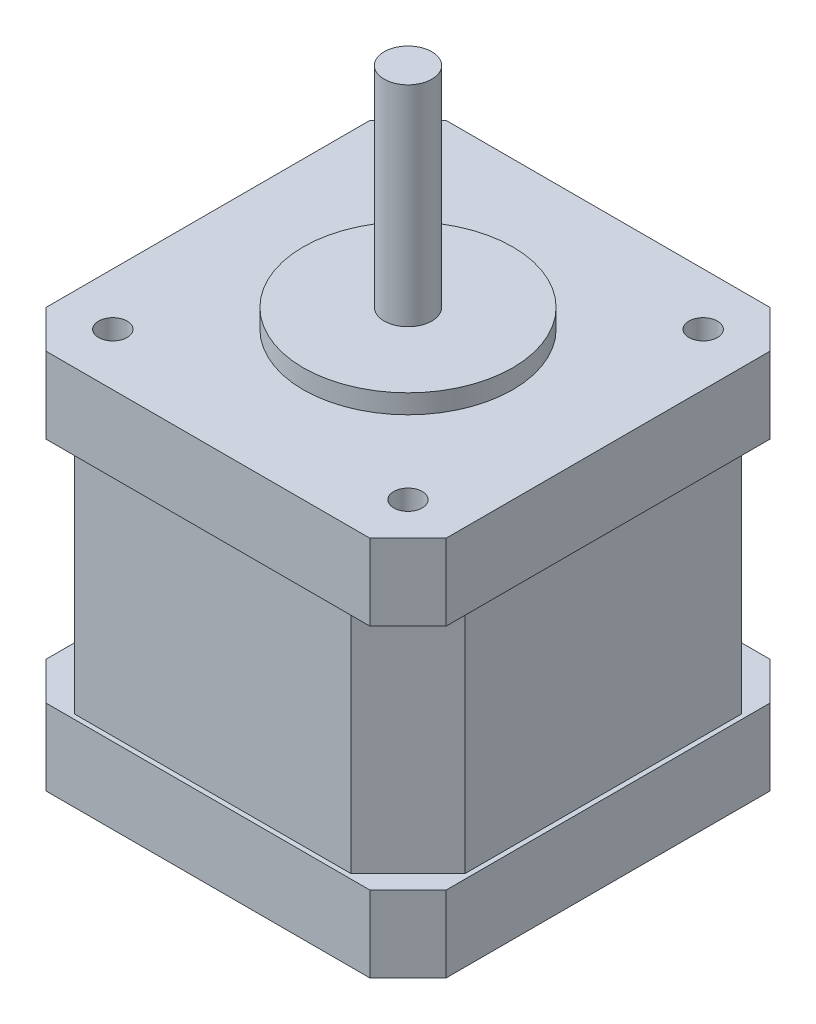
ISO-10303-21;
HEADER;
FILE_DESCRIPTION(('STEP AP214'),'2;1');
FILE_NAME('part.step','',(''),(''),'','','');
FILE_SCHEMA(('AUTOMOTIVE_DESIGN { 1 0 10303 214 1 1 1 1 }'));
ENDSEC;
DATA;
#1=APPLICATION_CONTEXT('core data for automotive mechanical design processes');
#2=APPLICATION_PROTOCOL_DEFINITION('international standard','automotive_design',2000,#1);
#3=PRODUCT_CONTEXT('',#1,'mechanical');
#4=PRODUCT('Part','Part','',(#3));
#5=PRODUCT_RELATED_PRODUCT_CATEGORY('part','',(#4));
#6=PRODUCT_DEFINITION_FORMATION('','',#4);
#7=PRODUCT_DEFINITION_CONTEXT('part definition',#1,'design');
#8=PRODUCT_DEFINITION('design','',#6,#7);
#9=PRODUCT_DEFINITION_SHAPE('','',#8);
#10=(LENGTH_UNIT() NAMED_UNIT(*) SI_UNIT(.MILLI.,.METRE.));
#11=(NAMED_UNIT(*) PLANE_ANGLE_UNIT() SI_UNIT($,.RADIAN.));
#12=(NAMED_UNIT(*) SI_UNIT($,.STERADIAN.) SOLID_ANGLE_UNIT());
#13=UNCERTAINTY_MEASURE_WITH_UNIT(LENGTH_MEASURE(1.E-05),#10,'distance_accuracy_value','');
#14=(GEOMETRIC_REPRESENTATION_CONTEXT(3) GLOBAL_UNCERTAINTY_ASSIGNED_CONTEXT((#13)) GLOBAL_UNIT_ASSIGNED_CONTEXT((#10,
#11,#12)) REPRESENTATION_CONTEXT('',''));
#15=CARTESIAN_POINT('',(0.,0.,0.));
#16=DIRECTION('',(0.,0.,1.));
#17=DIRECTION('',(1.,0.,0.));
#18=AXIS2_PLACEMENT_3D('',#15,#16,#17);
#19=CARTESIAN_POINT('',(0.,10.,0.));
#20=DIRECTION('',(0.,1.,0.));
#21=DIRECTION('',(0.,0.,1.));
#22=AXIS2_PLACEMENT_3D('',#19,#20,#21);
#23=PLANE('',#22);
#24=CARTESIAN_POINT('',(0.,10.,0.));
#25=DIRECTION('',(0.,1.,0.));
#26=DIRECTION('',(0.,0.,1.));
#27=AXIS2_PLACEMENT_3D('',#24,#25,#26);
#28=CIRCLE('',#27,11.);
#29=CARTESIAN_POINT('',(0.,10.,11.));
#30=VERTEX_POINT('',#29);
#31=EDGE_CURVE('E484',#30,#30,#28,.T.);
#32=ORIENTED_EDGE('',*,*,#31,.T.);
#33=EDGE_LOOP('',(#32));
#34=FACE_BOUND('',#33,.T.);
#35=CARTESIAN_POINT('',(0.,10.,0.));
#36=DIRECTION('',(0.,1.,0.));
#37=DIRECTION('',(0.,0.,1.));
#38=AXIS2_PLACEMENT_3D('',#35,#36,#37);
#39=CIRCLE('',#38,2.5);
#40=CARTESIAN_POINT('',(0.,10.,2.5));
#41=VERTEX_POINT('',#40);
#42=EDGE_CURVE('E500',#41,#41,#39,.T.);
#43=ORIENTED_EDGE('',*,*,#42,.F.);
#44=EDGE_LOOP('',(#43));
#45=FACE_BOUND('',#44,.T.);
#46=ADVANCED_FACE('F37',(#34,#45),#23,.T.);
#47=CARTESIAN_POINT('',(0.,8.,0.));
#48=DIRECTION('',(0.,1.,0.));
#49=DIRECTION('',(0.,0.,1.));
#50=AXIS2_PLACEMENT_3D('',#47,#48,#49);
#51=PLANE('',#50);
#52=CARTESIAN_POINT('',(-15.5,8.,15.5));
#53=DIRECTION('',(0.,1.,0.));
#54=DIRECTION('',(0.,0.,1.));
#55=AXIS2_PLACEMENT_3D('',#52,#53,#54);
#56=CIRCLE('',#55,1.5);
#57=CARTESIAN_POINT('',(-15.5,8.,17.));
#58=VERTEX_POINT('',#57);
#59=EDGE_CURVE('E524',#58,#58,#56,.T.);
#60=ORIENTED_EDGE('',*,*,#59,.F.);
#61=EDGE_LOOP('',(#60));
#62=FACE_BOUND('',#61,.T.);
#63=CARTESIAN_POINT('',(15.5,8.,15.5));
#64=DIRECTION('',(0.,1.,0.));
#65=DIRECTION('',(0.,0.,1.));
#66=AXIS2_PLACEMENT_3D('',#63,#64,#65);
#67=CIRCLE('',#66,1.5);
#68=CARTESIAN_POINT('',(15.5,8.,17.));
#69=VERTEX_POINT('',#68);
#70=EDGE_CURVE('E518',#69,#69,#67,.T.);
#71=ORIENTED_EDGE('',*,*,#70,.F.);
#72=EDGE_LOOP('',(#71));
#73=FACE_BOUND('',#72,.T.);
#74=CARTESIAN_POINT('',(15.5,8.,-15.5));
#75=DIRECTION('',(0.,1.,0.));
#76=DIRECTION('',(0.,0.,1.));
#77=AXIS2_PLACEMENT_3D('',#74,#75,#76);
#78=CIRCLE('',#77,1.5);
#79=CARTESIAN_POINT('',(15.5,8.,-14.));
#80=VERTEX_POINT('',#79);
#81=EDGE_CURVE('E512',#80,#80,#78,.T.);
#82=ORIENTED_EDGE('',*,*,#81,.F.);
#83=EDGE_LOOP('',(#82));
#84=FACE_BOUND('',#83,.T.);
#85=CARTESIAN_POINT('',(-15.5,8.,-15.5));
#86=DIRECTION('',(0.,1.,0.));
#87=DIRECTION('',(0.,0.,1.));
#88=AXIS2_PLACEMENT_3D('',#85,#86,#87);
#89=CIRCLE('',#88,1.5);
#90=CARTESIAN_POINT('',(-15.5,8.,-14.));
#91=VERTEX_POINT('',#90);
#92=EDGE_CURVE('E506',#91,#91,#89,.T.);
#93=ORIENTED_EDGE('',*,*,#92,.F.);
#94=EDGE_LOOP('',(#93));
#95=FACE_BOUND('',#94,.T.);
#96=DIRECTION('',(-1.,0.,0.));
#97=VECTOR('',#96,1.);
#98=CARTESIAN_POINT('',(-21.,8.,-21.));
#99=LINE('',#98,#97);
#100=CARTESIAN_POINT('',(17.,8.,-21.));
#101=VERTEX_POINT('',#100);
#102=CARTESIAN_POINT('',(-17.,8.,-21.));
#103=VERTEX_POINT('',#102);
#104=EDGE_CURVE('E210',#101,#103,#99,.T.);
#105=ORIENTED_EDGE('',*,*,#104,.T.);
#106=DIRECTION('',(0.707106781186549,0.,-0.707106781186546));
#107=VECTOR('',#106,1.);
#108=CARTESIAN_POINT('',(-19.,8.,-19.));
#109=LINE('',#108,#107);
#110=CARTESIAN_POINT('',(-21.,8.,-17.));
#111=VERTEX_POINT('',#110);
#112=EDGE_CURVE('E298',#103,#111,#109,.F.);
#113=ORIENTED_EDGE('',*,*,#112,.T.);
#114=DIRECTION('',(0.,0.,1.));
#115=VECTOR('',#114,1.);
#116=CARTESIAN_POINT('',(-21.,8.,-21.));
#117=LINE('',#116,#115);
#118=CARTESIAN_POINT('',(-21.,8.,17.));
#119=VERTEX_POINT('',#118);
#120=EDGE_CURVE('E322',#111,#119,#117,.T.);
#121=ORIENTED_EDGE('',*,*,#120,.T.);
#122=DIRECTION('',(-0.707106781186546,0.,-0.707106781186549));
#123=VECTOR('',#122,1.);
#124=CARTESIAN_POINT('',(-19.,8.,19.));
#125=LINE('',#124,#123);
#126=CARTESIAN_POINT('',(-17.,8.,21.));
#127=VERTEX_POINT('',#126);
#128=EDGE_CURVE('E296',#119,#127,#125,.F.);
#129=ORIENTED_EDGE('',*,*,#128,.T.);
#130=DIRECTION('',(1.,0.,0.));
#131=VECTOR('',#130,1.);
#132=CARTESIAN_POINT('',(-21.,8.,21.));
#133=LINE('',#132,#131);
#134=CARTESIAN_POINT('',(17.,8.,21.));
#135=VERTEX_POINT('',#134);
#136=EDGE_CURVE('E440',#127,#135,#133,.T.);
#137=ORIENTED_EDGE('',*,*,#136,.T.);
#138=DIRECTION('',(-0.707106781186548,0.,0.707106781186547));
#139=VECTOR('',#138,1.);
#140=CARTESIAN_POINT('',(19.,8.,19.));
#141=LINE('',#140,#139);
#142=CARTESIAN_POINT('',(21.,8.,17.));
#143=VERTEX_POINT('',#142);
#144=EDGE_CURVE('E57',#135,#143,#141,.F.);
#145=ORIENTED_EDGE('',*,*,#144,.T.);
#146=DIRECTION('',(0.,0.,-1.));
#147=VECTOR('',#146,1.);
#148=CARTESIAN_POINT('',(21.,8.,-21.));
#149=LINE('',#148,#147);
#150=CARTESIAN_POINT('',(21.,8.,-17.));
#151=VERTEX_POINT('',#150);
#152=EDGE_CURVE('E309',#143,#151,#149,.T.);
#153=ORIENTED_EDGE('',*,*,#152,.T.);
#154=DIRECTION('',(0.707106781186546,0.,0.707106781186549));
#155=VECTOR('',#154,1.);
#156=CARTESIAN_POINT('',(19.,8.,-19.));
#157=LINE('',#156,#155);
#158=EDGE_CURVE('E294',#151,#101,#157,.F.);
#159=ORIENTED_EDGE('',*,*,#158,.T.);
#160=EDGE_LOOP('',(#105,#113,#121,#129,#137,#145,#153,#159));
#161=FACE_BOUND('',#160,.T.);
#162=CARTESIAN_POINT('',(0.,8.,0.));
#163=DIRECTION('',(0.,1.,0.));
#164=DIRECTION('',(0.,0.,1.));
#165=AXIS2_PLACEMENT_3D('',#162,#163,#164);
#166=CIRCLE('',#165,11.);
#167=CARTESIAN_POINT('',(0.,8.,11.));
#168=VERTEX_POINT('',#167);
#169=EDGE_CURVE('E495',#168,#168,#166,.T.);
#170=ORIENTED_EDGE('',*,*,#169,.F.);
#171=EDGE_LOOP('',(#170));
#172=FACE_BOUND('',#171,.T.);
#173=ADVANCED_FACE('F370',(#62,#73,#84,#95,#161,#172),#51,.T.);
#174=CARTESIAN_POINT('',(0.,0.,0.));
#175=DIRECTION('',(0.,1.,0.));
#176=DIRECTION('',(0.,0.,1.));
#177=AXIS2_PLACEMENT_3D('',#174,#175,#176);
#178=PLANE('',#177);
#179=DIRECTION('',(0.,0.,1.));
#180=VECTOR('',#179,1.);
#181=CARTESIAN_POINT('',(-21.,0.,-21.));
#182=LINE('',#181,#180);
#183=CARTESIAN_POINT('',(-21.,0.,-17.));
#184=VERTEX_POINT('',#183);
#185=CARTESIAN_POINT('',(-21.,0.,17.));
#186=VERTEX_POINT('',#185);
#187=EDGE_CURVE('E324',#184,#186,#182,.T.);
#188=ORIENTED_EDGE('',*,*,#187,.F.);
#189=DIRECTION('',(-0.707106781186549,0.,0.707106781186546));
#190=VECTOR('',#189,1.);
#191=CARTESIAN_POINT('',(-21.,0.,-17.));
#192=LINE('',#191,#190);
#193=CARTESIAN_POINT('',(-17.,0.,-21.));
#194=VERTEX_POINT('',#193);
#195=EDGE_CURVE('E286',#184,#194,#192,.F.);
#196=ORIENTED_EDGE('',*,*,#195,.T.);
#197=DIRECTION('',(-1.,0.,0.));
#198=VECTOR('',#197,1.);
#199=CARTESIAN_POINT('',(-21.,0.,-21.));
#200=LINE('',#199,#198);
#201=CARTESIAN_POINT('',(17.,0.,-21.));
#202=VERTEX_POINT('',#201);
#203=EDGE_CURVE('E318',#202,#194,#200,.T.);
#204=ORIENTED_EDGE('',*,*,#203,.F.);
#205=DIRECTION('',(-0.707106781186546,0.,-0.707106781186549));
#206=VECTOR('',#205,1.);
#207=CARTESIAN_POINT('',(17.,0.,-21.));
#208=LINE('',#207,#206);
#209=CARTESIAN_POINT('',(21.,0.,-17.));
#210=VERTEX_POINT('',#209);
#211=EDGE_CURVE('E282',#202,#210,#208,.F.);
#212=ORIENTED_EDGE('',*,*,#211,.T.);
#213=DIRECTION('',(0.,0.,-1.));
#214=VECTOR('',#213,1.);
#215=CARTESIAN_POINT('',(21.,0.,-21.));
#216=LINE('',#215,#214);
#217=CARTESIAN_POINT('',(21.,0.,17.));
#218=VERTEX_POINT('',#217);
#219=EDGE_CURVE('E308',#218,#210,#216,.T.);
#220=ORIENTED_EDGE('',*,*,#219,.F.);
#221=DIRECTION('',(0.707106781186548,0.,-0.707106781186547));
#222=VECTOR('',#221,1.);
#223=CARTESIAN_POINT('',(21.,0.,17.));
#224=LINE('',#223,#222);
#225=CARTESIAN_POINT('',(17.,0.,21.));
#226=VERTEX_POINT('',#225);
#227=EDGE_CURVE('E280',#218,#226,#224,.F.);
#228=ORIENTED_EDGE('',*,*,#227,.T.);
#229=DIRECTION('',(1.,0.,0.));
#230=VECTOR('',#229,1.);
#231=CARTESIAN_POINT('',(-21.,0.,21.));
#232=LINE('',#231,#230);
#233=CARTESIAN_POINT('',(-17.,0.,21.));
#234=VERTEX_POINT('',#233);
#235=EDGE_CURVE('E319',#234,#226,#232,.T.);
#236=ORIENTED_EDGE('',*,*,#235,.F.);
#237=DIRECTION('',(0.707106781186546,0.,0.707106781186549));
#238=VECTOR('',#237,1.);
#239=CARTESIAN_POINT('',(-17.,0.,21.));
#240=LINE('',#239,#238);
#241=EDGE_CURVE('E284',#234,#186,#240,.F.);
#242=ORIENTED_EDGE('',*,*,#241,.T.);
#243=EDGE_LOOP('',(#188,#196,#204,#212,#220,#228,#236,#242));
#244=FACE_BOUND('',#243,.T.);
#245=DIRECTION('',(-1.,0.,0.));
#246=VECTOR('',#245,1.);
#247=CARTESIAN_POINT('',(20.5,0.,20.5));
#248=LINE('',#247,#246);
#249=CARTESIAN_POINT('',(14.5,0.,20.5));
#250=VERTEX_POINT('',#249);
#251=CARTESIAN_POINT('',(-14.5,0.,20.5));
#252=VERTEX_POINT('',#251);
#253=EDGE_CURVE('E456',#250,#252,#248,.T.);
#254=ORIENTED_EDGE('',*,*,#253,.F.);
#255=DIRECTION('',(-0.707106781186546,0.,0.707106781186549));
#256=VECTOR('',#255,1.);
#257=CARTESIAN_POINT('',(17.5,0.,17.5));
#258=LINE('',#257,#256);
#259=CARTESIAN_POINT('',(20.5,0.,14.5));
#260=VERTEX_POINT('',#259);
#261=EDGE_CURVE('E227',#250,#260,#258,.F.);
#262=ORIENTED_EDGE('',*,*,#261,.T.);
#263=DIRECTION('',(0.,0.,1.));
#264=VECTOR('',#263,1.);
#265=CARTESIAN_POINT('',(20.5,0.,-20.5));
#266=LINE('',#265,#264);
#267=CARTESIAN_POINT('',(20.5,0.,-14.5));
#268=VERTEX_POINT('',#267);
#269=EDGE_CURVE('E206',#268,#260,#266,.T.);
#270=ORIENTED_EDGE('',*,*,#269,.F.);
#271=DIRECTION('',(0.707106781186549,0.,0.707106781186546));
#272=VECTOR('',#271,1.);
#273=CARTESIAN_POINT('',(17.4999999999999,0.,-17.5));
#274=LINE('',#273,#272);
#275=CARTESIAN_POINT('',(14.5,0.,-20.5));
#276=VERTEX_POINT('',#275);
#277=EDGE_CURVE('E342',#268,#276,#274,.F.);
#278=ORIENTED_EDGE('',*,*,#277,.T.);
#279=DIRECTION('',(1.,0.,0.));
#280=VECTOR('',#279,1.);
#281=CARTESIAN_POINT('',(-20.5,0.,-20.5));
#282=LINE('',#281,#280);
#283=CARTESIAN_POINT('',(-14.5,0.,-20.5));
#284=VERTEX_POINT('',#283);
#285=EDGE_CURVE('E346',#284,#276,#282,.T.);
#286=ORIENTED_EDGE('',*,*,#285,.F.);
#287=DIRECTION('',(0.707106781186546,0.,-0.707106781186549));
#288=VECTOR('',#287,1.);
#289=CARTESIAN_POINT('',(-17.5,0.,-17.5));
#290=LINE('',#289,#288);
#291=CARTESIAN_POINT('',(-20.5,0.,-14.5));
#292=VERTEX_POINT('',#291);
#293=EDGE_CURVE('E235',#284,#292,#290,.F.);
#294=ORIENTED_EDGE('',*,*,#293,.T.);
#295=DIRECTION('',(0.,0.,-1.));
#296=VECTOR('',#295,1.);
#297=CARTESIAN_POINT('',(-20.5,0.,20.5));
#298=LINE('',#297,#296);
#299=CARTESIAN_POINT('',(-20.5,0.,14.5));
#300=VERTEX_POINT('',#299);
#301=EDGE_CURVE('E353',#300,#292,#298,.T.);
#302=ORIENTED_EDGE('',*,*,#301,.F.);
#303=DIRECTION('',(-0.707106781186549,0.,-0.707106781186546));
#304=VECTOR('',#303,1.);
#305=CARTESIAN_POINT('',(-17.4999999999999,0.,17.5));
#306=LINE('',#305,#304);
#307=EDGE_CURVE('E226',#300,#252,#306,.F.);
#308=ORIENTED_EDGE('',*,*,#307,.T.);
#309=EDGE_LOOP('',(#254,#262,#270,#278,#286,#294,#302,#308));
#310=FACE_BOUND('',#309,.T.);
#311=ADVANCED_FACE('F313',(#244,#310),#178,.F.);
#312=CARTESIAN_POINT('',(-21.,8.,-21.));
#313=DIRECTION('',(1.,0.,0.));
#314=DIRECTION('',(0.,0.,-1.));
#315=AXIS2_PLACEMENT_3D('',#312,#313,#314);
#316=PLANE('',#315);
#317=ORIENTED_EDGE('',*,*,#120,.F.);
#318=DIRECTION('',(0.,-1.,0.));
#319=VECTOR('',#318,1.);
#320=CARTESIAN_POINT('',(-21.,8.,-17.));
#321=LINE('',#320,#319);
#322=EDGE_CURVE('E277',#111,#184,#321,.T.);
#323=ORIENTED_EDGE('',*,*,#322,.T.);
#324=ORIENTED_EDGE('',*,*,#187,.T.);
#325=DIRECTION('',(0.,1.,0.));
#326=VECTOR('',#325,1.);
#327=CARTESIAN_POINT('',(-21.,8.,17.));
#328=LINE('',#327,#326);
#329=EDGE_CURVE('E275',#186,#119,#328,.T.);
#330=ORIENTED_EDGE('',*,*,#329,.T.);
#331=EDGE_LOOP('',(#317,#323,#324,#330));
#332=FACE_BOUND('',#331,.T.);
#333=ADVANCED_FACE('F421',(#332),#316,.F.);
#334=CARTESIAN_POINT('',(-21.,8.,21.));
#335=DIRECTION('',(0.,0.,-1.));
#336=DIRECTION('',(-1.,0.,0.));
#337=AXIS2_PLACEMENT_3D('',#334,#335,#336);
#338=PLANE('',#337);
#339=ORIENTED_EDGE('',*,*,#136,.F.);
#340=DIRECTION('',(0.,-1.,0.));
#341=VECTOR('',#340,1.);
#342=CARTESIAN_POINT('',(-17.,8.,21.));
#343=LINE('',#342,#341);
#344=EDGE_CURVE('E302',#127,#234,#343,.T.);
#345=ORIENTED_EDGE('',*,*,#344,.T.);
#346=ORIENTED_EDGE('',*,*,#235,.T.);
#347=DIRECTION('',(0.,1.,0.));
#348=VECTOR('',#347,1.);
#349=CARTESIAN_POINT('',(17.,8.,21.));
#350=LINE('',#349,#348);
#351=EDGE_CURVE('E300',#226,#135,#350,.T.);
#352=ORIENTED_EDGE('',*,*,#351,.T.);
#353=EDGE_LOOP('',(#339,#345,#346,#352));
#354=FACE_BOUND('',#353,.T.);
#355=ADVANCED_FACE('F427',(#354),#338,.F.);
#356=CARTESIAN_POINT('',(21.,8.,-21.));
#357=DIRECTION('',(-1.,0.,0.));
#358=DIRECTION('',(0.,0.,1.));
#359=AXIS2_PLACEMENT_3D('',#356,#357,#358);
#360=PLANE('',#359);
#361=ORIENTED_EDGE('',*,*,#219,.T.);
#362=DIRECTION('',(0.,1.,0.));
#363=VECTOR('',#362,1.);
#364=CARTESIAN_POINT('',(21.,8.,-17.));
#365=LINE('',#364,#363);
#366=EDGE_CURVE('E11',#210,#151,#365,.T.);
#367=ORIENTED_EDGE('',*,*,#366,.T.);
#368=ORIENTED_EDGE('',*,*,#152,.F.);
#369=DIRECTION('',(0.,-1.,0.));
#370=VECTOR('',#369,1.);
#371=CARTESIAN_POINT('',(21.,8.,17.));
#372=LINE('',#371,#370);
#373=EDGE_CURVE('E45',#143,#218,#372,.T.);
#374=ORIENTED_EDGE('',*,*,#373,.T.);
#375=EDGE_LOOP('',(#361,#367,#368,#374));
#376=FACE_BOUND('',#375,.T.);
#377=ADVANCED_FACE('F307',(#376),#360,.F.);
#378=CARTESIAN_POINT('',(-21.,8.,-21.));
#379=DIRECTION('',(0.,0.,1.));
#380=DIRECTION('',(1.,0.,0.));
#381=AXIS2_PLACEMENT_3D('',#378,#379,#380);
#382=PLANE('',#381);
#383=ORIENTED_EDGE('',*,*,#203,.T.);
#384=DIRECTION('',(0.,1.,0.));
#385=VECTOR('',#384,1.);
#386=CARTESIAN_POINT('',(-17.,8.,-21.));
#387=LINE('',#386,#385);
#388=EDGE_CURVE('E291',#194,#103,#387,.T.);
#389=ORIENTED_EDGE('',*,*,#388,.T.);
#390=ORIENTED_EDGE('',*,*,#104,.F.);
#391=DIRECTION('',(0.,-1.,0.));
#392=VECTOR('',#391,1.);
#393=CARTESIAN_POINT('',(17.,8.,-21.));
#394=LINE('',#393,#392);
#395=EDGE_CURVE('E288',#101,#202,#394,.T.);
#396=ORIENTED_EDGE('',*,*,#395,.T.);
#397=EDGE_LOOP('',(#383,#389,#390,#396));
#398=FACE_BOUND('',#397,.T.);
#399=ADVANCED_FACE('F415',(#398),#382,.F.);
#400=CARTESIAN_POINT('',(20.5,-500000.,20.5));
#401=DIRECTION('',(0.,0.,-1.));
#402=DIRECTION('',(-1.,0.,0.));
#403=AXIS2_PLACEMENT_3D('',#400,#401,#402);
#404=PLANE('',#403);
#405=DIRECTION('',(1.,0.,0.));
#406=VECTOR('',#405,1.);
#407=CARTESIAN_POINT('',(20.5,-24.0000000000009,20.5));
#408=LINE('',#407,#406);
#409=CARTESIAN_POINT('',(-14.5,-24.0000000000009,20.5));
#410=VERTEX_POINT('',#409);
#411=CARTESIAN_POINT('',(14.5,-24.0000000000009,20.5));
#412=VERTEX_POINT('',#411);
#413=EDGE_CURVE('E468',#410,#412,#408,.T.);
#414=ORIENTED_EDGE('',*,*,#413,.T.);
#415=DIRECTION('',(0.,1.,0.));
#416=VECTOR('',#415,1.);
#417=CARTESIAN_POINT('',(14.5,-500000.,20.5));
#418=LINE('',#417,#416);
#419=EDGE_CURVE('E225',#412,#250,#418,.T.);
#420=ORIENTED_EDGE('',*,*,#419,.T.);
#421=ORIENTED_EDGE('',*,*,#253,.T.);
#422=DIRECTION('',(0.,-1.,0.));
#423=VECTOR('',#422,1.);
#424=CARTESIAN_POINT('',(-14.5,-500000.,20.5));
#425=LINE('',#424,#423);
#426=EDGE_CURVE('E334',#252,#410,#425,.T.);
#427=ORIENTED_EDGE('',*,*,#426,.T.);
#428=EDGE_LOOP('',(#414,#420,#421,#427));
#429=FACE_BOUND('',#428,.T.);
#430=ADVANCED_FACE('F391',(#429),#404,.F.);
#431=CARTESIAN_POINT('',(-20.5,-500000.,20.5));
#432=DIRECTION('',(1.,0.,0.));
#433=DIRECTION('',(0.,0.,-1.));
#434=AXIS2_PLACEMENT_3D('',#431,#432,#433);
#435=PLANE('',#434);
#436=DIRECTION('',(0.,0.,1.));
#437=VECTOR('',#436,1.);
#438=CARTESIAN_POINT('',(-20.5,-24.0000000000009,20.5));
#439=LINE('',#438,#437);
#440=CARTESIAN_POINT('',(-20.5,-24.0000000000009,-14.5));
#441=VERTEX_POINT('',#440);
#442=CARTESIAN_POINT('',(-20.5,-24.0000000000009,14.5));
#443=VERTEX_POINT('',#442);
#444=EDGE_CURVE('E465',#441,#443,#439,.T.);
#445=ORIENTED_EDGE('',*,*,#444,.T.);
#446=DIRECTION('',(0.,1.,0.));
#447=VECTOR('',#446,1.);
#448=CARTESIAN_POINT('',(-20.5,-500000.,14.5));
#449=LINE('',#448,#447);
#450=EDGE_CURVE('E339',#443,#300,#449,.T.);
#451=ORIENTED_EDGE('',*,*,#450,.T.);
#452=ORIENTED_EDGE('',*,*,#301,.T.);
#453=DIRECTION('',(0.,-1.,0.));
#454=VECTOR('',#453,1.);
#455=CARTESIAN_POINT('',(-20.5,-500000.,-14.5));
#456=LINE('',#455,#454);
#457=EDGE_CURVE('E337',#292,#441,#456,.T.);
#458=ORIENTED_EDGE('',*,*,#457,.T.);
#459=EDGE_LOOP('',(#445,#451,#452,#458));
#460=FACE_BOUND('',#459,.T.);
#461=ADVANCED_FACE('F407',(#460),#435,.F.);
#462=CARTESIAN_POINT('',(-20.5,-500000.,-20.5));
#463=DIRECTION('',(0.,0.,1.));
#464=DIRECTION('',(1.,0.,0.));
#465=AXIS2_PLACEMENT_3D('',#462,#463,#464);
#466=PLANE('',#465);
#467=ORIENTED_EDGE('',*,*,#285,.T.);
#468=DIRECTION('',(0.,-1.,0.));
#469=VECTOR('',#468,1.);
#470=CARTESIAN_POINT('',(14.5,-500000.,-20.5));
#471=LINE('',#470,#469);
#472=CARTESIAN_POINT('',(14.5,-24.0000000000009,-20.5));
#473=VERTEX_POINT('',#472);
#474=EDGE_CURVE('E332',#276,#473,#471,.T.);
#475=ORIENTED_EDGE('',*,*,#474,.T.);
#476=DIRECTION('',(-1.,0.,0.));
#477=VECTOR('',#476,1.);
#478=CARTESIAN_POINT('',(-20.5,-24.0000000000009,-20.5));
#479=LINE('',#478,#477);
#480=CARTESIAN_POINT('',(-14.5,-24.0000000000009,-20.5));
#481=VERTEX_POINT('',#480);
#482=EDGE_CURVE('E220',#473,#481,#479,.T.);
#483=ORIENTED_EDGE('',*,*,#482,.T.);
#484=DIRECTION('',(0.,1.,0.));
#485=VECTOR('',#484,1.);
#486=CARTESIAN_POINT('',(-14.5,-500000.,-20.5));
#487=LINE('',#486,#485);
#488=EDGE_CURVE('E329',#481,#284,#487,.T.);
#489=ORIENTED_EDGE('',*,*,#488,.T.);
#490=EDGE_LOOP('',(#467,#475,#483,#489));
#491=FACE_BOUND('',#490,.T.);
#492=ADVANCED_FACE('F350',(#491),#466,.F.);
#493=CARTESIAN_POINT('',(20.5,-500000.,-20.5));
#494=DIRECTION('',(-1.,0.,0.));
#495=DIRECTION('',(0.,0.,1.));
#496=AXIS2_PLACEMENT_3D('',#493,#494,#495);
#497=PLANE('',#496);
#498=DIRECTION('',(0.,0.,-1.));
#499=VECTOR('',#498,1.);
#500=CARTESIAN_POINT('',(20.5,-24.0000000000009,-20.5));
#501=LINE('',#500,#499);
#502=CARTESIAN_POINT('',(20.5,-24.0000000000009,14.5));
#503=VERTEX_POINT('',#502);
#504=CARTESIAN_POINT('',(20.5,-24.0000000000009,-14.5));
#505=VERTEX_POINT('',#504);
#506=EDGE_CURVE('E203',#503,#505,#501,.T.);
#507=ORIENTED_EDGE('',*,*,#506,.T.);
#508=DIRECTION('',(0.,1.,0.));
#509=VECTOR('',#508,1.);
#510=CARTESIAN_POINT('',(20.5,-500000.,-14.5));
#511=LINE('',#510,#509);
#512=EDGE_CURVE('E209',#505,#268,#511,.T.);
#513=ORIENTED_EDGE('',*,*,#512,.T.);
#514=ORIENTED_EDGE('',*,*,#269,.T.);
#515=DIRECTION('',(0.,-1.,0.));
#516=VECTOR('',#515,1.);
#517=CARTESIAN_POINT('',(20.5,-500000.,14.5));
#518=LINE('',#517,#516);
#519=EDGE_CURVE('E199',#260,#503,#518,.T.);
#520=ORIENTED_EDGE('',*,*,#519,.T.);
#521=EDGE_LOOP('',(#507,#513,#514,#520));
#522=FACE_BOUND('',#521,.T.);
#523=ADVANCED_FACE('F201',(#522),#497,.F.);
#524=CARTESIAN_POINT('',(0.,-24.,0.));
#525=DIRECTION('',(0.,1.,0.));
#526=DIRECTION('',(0.,0.,1.));
#527=AXIS2_PLACEMENT_3D('',#524,#525,#526);
#528=PLANE('',#527);
#529=DIRECTION('',(-1.,0.,0.));
#530=VECTOR('',#529,1.);
#531=CARTESIAN_POINT('',(-21.,-24.,-21.));
#532=LINE('',#531,#530);
#533=CARTESIAN_POINT('',(17.,-24.,-21.));
#534=VERTEX_POINT('',#533);
#535=CARTESIAN_POINT('',(-17.,-24.,-21.));
#536=VERTEX_POINT('',#535);
#537=EDGE_CURVE('E470',#534,#536,#532,.T.);
#538=ORIENTED_EDGE('',*,*,#537,.T.);
#539=DIRECTION('',(0.707106781186549,0.,-0.707106781186546));
#540=VECTOR('',#539,1.);
#541=CARTESIAN_POINT('',(-19.,-24.,-19.));
#542=LINE('',#541,#540);
#543=CARTESIAN_POINT('',(-21.,-24.,-17.));
#544=VERTEX_POINT('',#543);
#545=EDGE_CURVE('E263',#536,#544,#542,.F.);
#546=ORIENTED_EDGE('',*,*,#545,.T.);
#547=DIRECTION('',(0.,0.,1.));
#548=VECTOR('',#547,1.);
#549=CARTESIAN_POINT('',(-21.,-24.,-21.));
#550=LINE('',#549,#548);
#551=CARTESIAN_POINT('',(-21.,-24.,17.));
#552=VERTEX_POINT('',#551);
#553=EDGE_CURVE('E474',#544,#552,#550,.T.);
#554=ORIENTED_EDGE('',*,*,#553,.T.);
#555=DIRECTION('',(-0.707106781186546,0.,-0.707106781186549));
#556=VECTOR('',#555,1.);
#557=CARTESIAN_POINT('',(-19.,-24.,19.));
#558=LINE('',#557,#556);
#559=CARTESIAN_POINT('',(-17.,-24.,21.));
#560=VERTEX_POINT('',#559);
#561=EDGE_CURVE('E261',#552,#560,#558,.F.);
#562=ORIENTED_EDGE('',*,*,#561,.T.);
#563=DIRECTION('',(1.,0.,0.));
#564=VECTOR('',#563,1.);
#565=CARTESIAN_POINT('',(-21.,-24.,21.));
#566=LINE('',#565,#564);
#567=CARTESIAN_POINT('',(17.,-24.,21.));
#568=VERTEX_POINT('',#567);
#569=EDGE_CURVE('E490',#560,#568,#566,.T.);
#570=ORIENTED_EDGE('',*,*,#569,.T.);
#571=DIRECTION('',(-0.707106781186548,0.,0.707106781186547));
#572=VECTOR('',#571,1.);
#573=CARTESIAN_POINT('',(19.,-24.,19.));
#574=LINE('',#573,#572);
#575=CARTESIAN_POINT('',(21.,-24.,17.));
#576=VERTEX_POINT('',#575);
#577=EDGE_CURVE('E257',#568,#576,#574,.F.);
#578=ORIENTED_EDGE('',*,*,#577,.T.);
#579=DIRECTION('',(0.,0.,-1.));
#580=VECTOR('',#579,1.);
#581=CARTESIAN_POINT('',(21.,-24.,-21.));
#582=LINE('',#581,#580);
#583=CARTESIAN_POINT('',(21.,-24.,-17.));
#584=VERTEX_POINT('',#583);
#585=EDGE_CURVE('E487',#576,#584,#582,.T.);
#586=ORIENTED_EDGE('',*,*,#585,.T.);
#587=DIRECTION('',(0.707106781186546,0.,0.707106781186549));
#588=VECTOR('',#587,1.);
#589=CARTESIAN_POINT('',(19.,-24.,-19.));
#590=LINE('',#589,#588);
#591=EDGE_CURVE('E259',#584,#534,#590,.F.);
#592=ORIENTED_EDGE('',*,*,#591,.T.);
#593=EDGE_LOOP('',(#538,#546,#554,#562,#570,#578,#586,#592));
#594=FACE_BOUND('',#593,.T.);
#595=ORIENTED_EDGE('',*,*,#413,.F.);
#596=DIRECTION('',(0.707106781186549,0.,0.707106781186546));
#597=VECTOR('',#596,1.);
#598=CARTESIAN_POINT('',(-20.5,-24.0000000000009,14.5));
#599=LINE('',#598,#597);
#600=EDGE_CURVE('E229',#410,#443,#599,.F.);
#601=ORIENTED_EDGE('',*,*,#600,.T.);
#602=ORIENTED_EDGE('',*,*,#444,.F.);
#603=DIRECTION('',(-0.707106781186546,0.,0.707106781186549));
#604=VECTOR('',#603,1.);
#605=CARTESIAN_POINT('',(-14.5,-24.0000000000009,-20.5));
#606=LINE('',#605,#604);
#607=EDGE_CURVE('E237',#441,#481,#606,.F.);
#608=ORIENTED_EDGE('',*,*,#607,.T.);
#609=ORIENTED_EDGE('',*,*,#482,.F.);
#610=DIRECTION('',(-0.707106781186549,0.,-0.707106781186546));
#611=VECTOR('',#610,1.);
#612=CARTESIAN_POINT('',(20.5,-24.0000000000009,-14.5));
#613=LINE('',#612,#611);
#614=EDGE_CURVE('E219',#473,#505,#613,.F.);
#615=ORIENTED_EDGE('',*,*,#614,.T.);
#616=ORIENTED_EDGE('',*,*,#506,.F.);
#617=DIRECTION('',(0.707106781186546,0.,-0.707106781186549));
#618=VECTOR('',#617,1.);
#619=CARTESIAN_POINT('',(14.5,-24.0000000000009,20.5));
#620=LINE('',#619,#618);
#621=EDGE_CURVE('E215',#503,#412,#620,.F.);
#622=ORIENTED_EDGE('',*,*,#621,.T.);
#623=EDGE_LOOP('',(#595,#601,#602,#608,#609,#615,#616,#622));
#624=FACE_BOUND('',#623,.T.);
#625=ADVANCED_FACE('F214',(#594,#624),#528,.T.);
#626=CARTESIAN_POINT('',(-21.,-24.,-21.));
#627=DIRECTION('',(1.,0.,0.));
#628=DIRECTION('',(0.,0.,-1.));
#629=AXIS2_PLACEMENT_3D('',#626,#627,#628);
#630=PLANE('',#629);
#631=ORIENTED_EDGE('',*,*,#553,.F.);
#632=DIRECTION('',(0.,-1.,0.));
#633=VECTOR('',#632,1.);
#634=CARTESIAN_POINT('',(-21.,-24.,-17.));
#635=LINE('',#634,#633);
#636=CARTESIAN_POINT('',(-21.,-32.,-17.));
#637=VERTEX_POINT('',#636);
#638=EDGE_CURVE('E241',#544,#637,#635,.T.);
#639=ORIENTED_EDGE('',*,*,#638,.T.);
#640=DIRECTION('',(0.,0.,1.));
#641=VECTOR('',#640,1.);
#642=CARTESIAN_POINT('',(-21.,-32.,-21.));
#643=LINE('',#642,#641);
#644=CARTESIAN_POINT('',(-21.,-32.,17.));
#645=VERTEX_POINT('',#644);
#646=EDGE_CURVE('E481',#637,#645,#643,.T.);
#647=ORIENTED_EDGE('',*,*,#646,.T.);
#648=DIRECTION('',(0.,1.,0.));
#649=VECTOR('',#648,1.);
#650=CARTESIAN_POINT('',(-21.,-24.,17.));
#651=LINE('',#650,#649);
#652=EDGE_CURVE('E239',#645,#552,#651,.T.);
#653=ORIENTED_EDGE('',*,*,#652,.T.);
#654=EDGE_LOOP('',(#631,#639,#647,#653));
#655=FACE_BOUND('',#654,.T.);
#656=ADVANCED_FACE('F389',(#655),#630,.F.);
#657=CARTESIAN_POINT('',(-21.,-24.,21.));
#658=DIRECTION('',(0.,0.,-1.));
#659=DIRECTION('',(-1.,0.,0.));
#660=AXIS2_PLACEMENT_3D('',#657,#658,#659);
#661=PLANE('',#660);
#662=ORIENTED_EDGE('',*,*,#569,.F.);
#663=DIRECTION('',(0.,-1.,0.));
#664=VECTOR('',#663,1.);
#665=CARTESIAN_POINT('',(-17.,-24.,21.));
#666=LINE('',#665,#664);
#667=CARTESIAN_POINT('',(-17.,-32.,21.));
#668=VERTEX_POINT('',#667);
#669=EDGE_CURVE('E267',#560,#668,#666,.T.);
#670=ORIENTED_EDGE('',*,*,#669,.T.);
#671=DIRECTION('',(1.,0.,0.));
#672=VECTOR('',#671,1.);
#673=CARTESIAN_POINT('',(-21.,-32.,21.));
#674=LINE('',#673,#672);
#675=CARTESIAN_POINT('',(17.,-32.,21.));
#676=VERTEX_POINT('',#675);
#677=EDGE_CURVE('E478',#668,#676,#674,.T.);
#678=ORIENTED_EDGE('',*,*,#677,.T.);
#679=DIRECTION('',(0.,1.,0.));
#680=VECTOR('',#679,1.);
#681=CARTESIAN_POINT('',(17.,-24.,21.));
#682=LINE('',#681,#680);
#683=EDGE_CURVE('E265',#676,#568,#682,.T.);
#684=ORIENTED_EDGE('',*,*,#683,.T.);
#685=EDGE_LOOP('',(#662,#670,#678,#684));
#686=FACE_BOUND('',#685,.T.);
#687=ADVANCED_FACE('F399',(#686),#661,.F.);
#688=CARTESIAN_POINT('',(21.,-24.,-21.));
#689=DIRECTION('',(-1.,0.,0.));
#690=DIRECTION('',(0.,0.,1.));
#691=AXIS2_PLACEMENT_3D('',#688,#689,#690);
#692=PLANE('',#691);
#693=DIRECTION('',(0.,0.,-1.));
#694=VECTOR('',#693,1.);
#695=CARTESIAN_POINT('',(21.,-32.,-21.));
#696=LINE('',#695,#694);
#697=CARTESIAN_POINT('',(21.,-32.,17.));
#698=VERTEX_POINT('',#697);
#699=CARTESIAN_POINT('',(21.,-32.,-17.));
#700=VERTEX_POINT('',#699);
#701=EDGE_CURVE('E475',#698,#700,#696,.T.);
#702=ORIENTED_EDGE('',*,*,#701,.T.);
#703=DIRECTION('',(0.,1.,0.));
#704=VECTOR('',#703,1.);
#705=CARTESIAN_POINT('',(21.,-24.,-17.));
#706=LINE('',#705,#704);
#707=EDGE_CURVE('E273',#700,#584,#706,.T.);
#708=ORIENTED_EDGE('',*,*,#707,.T.);
#709=ORIENTED_EDGE('',*,*,#585,.F.);
#710=DIRECTION('',(0.,-1.,0.));
#711=VECTOR('',#710,1.);
#712=CARTESIAN_POINT('',(21.,-24.,17.));
#713=LINE('',#712,#711);
#714=EDGE_CURVE('E270',#576,#698,#713,.T.);
#715=ORIENTED_EDGE('',*,*,#714,.T.);
#716=EDGE_LOOP('',(#702,#708,#709,#715));
#717=FACE_BOUND('',#716,.T.);
#718=ADVANCED_FACE('F395',(#717),#692,.F.);
#719=CARTESIAN_POINT('',(-21.,-24.,-21.));
#720=DIRECTION('',(0.,0.,1.));
#721=DIRECTION('',(1.,0.,0.));
#722=AXIS2_PLACEMENT_3D('',#719,#720,#721);
#723=PLANE('',#722);
#724=DIRECTION('',(-1.,0.,0.));
#725=VECTOR('',#724,1.);
#726=CARTESIAN_POINT('',(-21.,-32.,-21.));
#727=LINE('',#726,#725);
#728=CARTESIAN_POINT('',(17.,-32.,-21.));
#729=VERTEX_POINT('',#728);
#730=CARTESIAN_POINT('',(-17.,-32.,-21.));
#731=VERTEX_POINT('',#730);
#732=EDGE_CURVE('E471',#729,#731,#727,.T.);
#733=ORIENTED_EDGE('',*,*,#732,.T.);
#734=DIRECTION('',(0.,1.,0.));
#735=VECTOR('',#734,1.);
#736=CARTESIAN_POINT('',(-17.,-24.,-21.));
#737=LINE('',#736,#735);
#738=EDGE_CURVE('E255',#731,#536,#737,.T.);
#739=ORIENTED_EDGE('',*,*,#738,.T.);
#740=ORIENTED_EDGE('',*,*,#537,.F.);
#741=DIRECTION('',(0.,-1.,0.));
#742=VECTOR('',#741,1.);
#743=CARTESIAN_POINT('',(17.,-24.,-21.));
#744=LINE('',#743,#742);
#745=EDGE_CURVE('E252',#534,#729,#744,.T.);
#746=ORIENTED_EDGE('',*,*,#745,.T.);
#747=EDGE_LOOP('',(#733,#739,#740,#746));
#748=FACE_BOUND('',#747,.T.);
#749=ADVANCED_FACE('F365',(#748),#723,.F.);
#750=CARTESIAN_POINT('',(0.,-32.,0.));
#751=DIRECTION('',(0.,1.,0.));
#752=DIRECTION('',(0.,0.,1.));
#753=AXIS2_PLACEMENT_3D('',#750,#751,#752);
#754=PLANE('',#753);
#755=ORIENTED_EDGE('',*,*,#646,.F.);
#756=DIRECTION('',(-0.707106781186549,0.,0.707106781186546));
#757=VECTOR('',#756,1.);
#758=CARTESIAN_POINT('',(-21.,-32.,-17.));
#759=LINE('',#758,#757);
#760=EDGE_CURVE('E250',#637,#731,#759,.F.);
#761=ORIENTED_EDGE('',*,*,#760,.T.);
#762=ORIENTED_EDGE('',*,*,#732,.F.);
#763=DIRECTION('',(-0.707106781186546,0.,-0.707106781186549));
#764=VECTOR('',#763,1.);
#765=CARTESIAN_POINT('',(17.,-32.,-21.));
#766=LINE('',#765,#764);
#767=EDGE_CURVE('E246',#729,#700,#766,.F.);
#768=ORIENTED_EDGE('',*,*,#767,.T.);
#769=ORIENTED_EDGE('',*,*,#701,.F.);
#770=DIRECTION('',(0.707106781186548,0.,-0.707106781186547));
#771=VECTOR('',#770,1.);
#772=CARTESIAN_POINT('',(21.,-32.,17.));
#773=LINE('',#772,#771);
#774=EDGE_CURVE('E244',#698,#676,#773,.F.);
#775=ORIENTED_EDGE('',*,*,#774,.T.);
#776=ORIENTED_EDGE('',*,*,#677,.F.);
#777=DIRECTION('',(0.707106781186546,0.,0.707106781186549));
#778=VECTOR('',#777,1.);
#779=CARTESIAN_POINT('',(-17.,-32.,21.));
#780=LINE('',#779,#778);
#781=EDGE_CURVE('E248',#668,#645,#780,.F.);
#782=ORIENTED_EDGE('',*,*,#781,.T.);
#783=EDGE_LOOP('',(#755,#761,#762,#768,#769,#775,#776,#782));
#784=FACE_BOUND('',#783,.T.);
#785=ADVANCED_FACE('F357',(#784),#754,.F.);
#786=CARTESIAN_POINT('',(20.5,-500000.,-14.5));
#787=DIRECTION('',(-0.707106781186546,0.,0.707106781186549));
#788=DIRECTION('',(0.,1.,0.));
#789=AXIS2_PLACEMENT_3D('',#786,#787,#788);
#790=PLANE('',#789);
#791=ORIENTED_EDGE('',*,*,#614,.F.);
#792=ORIENTED_EDGE('',*,*,#474,.F.);
#793=ORIENTED_EDGE('',*,*,#277,.F.);
#794=ORIENTED_EDGE('',*,*,#512,.F.);
#795=EDGE_LOOP('',(#791,#792,#793,#794));
#796=FACE_BOUND('',#795,.T.);
#797=ADVANCED_FACE('F355',(#796),#790,.F.);
#798=CARTESIAN_POINT('',(14.5,-500000.,20.5));
#799=DIRECTION('',(-0.707106781186549,0.,-0.707106781186546));
#800=DIRECTION('',(0.,1.,0.));
#801=AXIS2_PLACEMENT_3D('',#798,#799,#800);
#802=PLANE('',#801);
#803=ORIENTED_EDGE('',*,*,#621,.F.);
#804=ORIENTED_EDGE('',*,*,#519,.F.);
#805=ORIENTED_EDGE('',*,*,#261,.F.);
#806=ORIENTED_EDGE('',*,*,#419,.F.);
#807=EDGE_LOOP('',(#803,#804,#805,#806));
#808=FACE_BOUND('',#807,.T.);
#809=ADVANCED_FACE('F223',(#808),#802,.F.);
#810=CARTESIAN_POINT('',(-20.5,-500000.,14.5));
#811=DIRECTION('',(0.707106781186546,0.,-0.707106781186549));
#812=DIRECTION('',(0.,1.,0.));
#813=AXIS2_PLACEMENT_3D('',#810,#811,#812);
#814=PLANE('',#813);
#815=ORIENTED_EDGE('',*,*,#600,.F.);
#816=ORIENTED_EDGE('',*,*,#426,.F.);
#817=ORIENTED_EDGE('',*,*,#307,.F.);
#818=ORIENTED_EDGE('',*,*,#450,.F.);
#819=EDGE_LOOP('',(#815,#816,#817,#818));
#820=FACE_BOUND('',#819,.T.);
#821=ADVANCED_FACE('F363',(#820),#814,.F.);
#822=CARTESIAN_POINT('',(-14.5,-500000.,-20.5));
#823=DIRECTION('',(0.707106781186549,0.,0.707106781186546));
#824=DIRECTION('',(0.,1.,0.));
#825=AXIS2_PLACEMENT_3D('',#822,#823,#824);
#826=PLANE('',#825);
#827=ORIENTED_EDGE('',*,*,#607,.F.);
#828=ORIENTED_EDGE('',*,*,#457,.F.);
#829=ORIENTED_EDGE('',*,*,#293,.F.);
#830=ORIENTED_EDGE('',*,*,#488,.F.);
#831=EDGE_LOOP('',(#827,#828,#829,#830));
#832=FACE_BOUND('',#831,.T.);
#833=ADVANCED_FACE('F708',(#832),#826,.F.);
#834=CARTESIAN_POINT('',(-21.,-24.,-17.));
#835=DIRECTION('',(0.707106781186546,0.,0.707106781186549));
#836=DIRECTION('',(0.,-1.,0.));
#837=AXIS2_PLACEMENT_3D('',#834,#835,#836);
#838=PLANE('',#837);
#839=ORIENTED_EDGE('',*,*,#545,.F.);
#840=ORIENTED_EDGE('',*,*,#738,.F.);
#841=ORIENTED_EDGE('',*,*,#760,.F.);
#842=ORIENTED_EDGE('',*,*,#638,.F.);
#843=EDGE_LOOP('',(#839,#840,#841,#842));
#844=FACE_BOUND('',#843,.T.);
#845=ADVANCED_FACE('F698',(#844),#838,.F.);
#846=CARTESIAN_POINT('',(-17.,-24.,21.));
#847=DIRECTION('',(0.707106781186549,0.,-0.707106781186546));
#848=DIRECTION('',(0.,-1.,0.));
#849=AXIS2_PLACEMENT_3D('',#846,#847,#848);
#850=PLANE('',#849);
#851=ORIENTED_EDGE('',*,*,#561,.F.);
#852=ORIENTED_EDGE('',*,*,#652,.F.);
#853=ORIENTED_EDGE('',*,*,#781,.F.);
#854=ORIENTED_EDGE('',*,*,#669,.F.);
#855=EDGE_LOOP('',(#851,#852,#853,#854));
#856=FACE_BOUND('',#855,.T.);
#857=ADVANCED_FACE('F688',(#856),#850,.F.);
#858=CARTESIAN_POINT('',(17.,-24.,-21.));
#859=DIRECTION('',(-0.707106781186549,0.,0.707106781186546));
#860=DIRECTION('',(0.,-1.,0.));
#861=AXIS2_PLACEMENT_3D('',#858,#859,#860);
#862=PLANE('',#861);
#863=ORIENTED_EDGE('',*,*,#591,.F.);
#864=ORIENTED_EDGE('',*,*,#707,.F.);
#865=ORIENTED_EDGE('',*,*,#767,.F.);
#866=ORIENTED_EDGE('',*,*,#745,.F.);
#867=EDGE_LOOP('',(#863,#864,#865,#866));
#868=FACE_BOUND('',#867,.T.);
#869=ADVANCED_FACE('F678',(#868),#862,.F.);
#870=CARTESIAN_POINT('',(21.,-24.,17.));
#871=DIRECTION('',(-0.707106781186547,0.,-0.707106781186548));
#872=DIRECTION('',(0.,-1.,0.));
#873=AXIS2_PLACEMENT_3D('',#870,#871,#872);
#874=PLANE('',#873);
#875=ORIENTED_EDGE('',*,*,#577,.F.);
#876=ORIENTED_EDGE('',*,*,#683,.F.);
#877=ORIENTED_EDGE('',*,*,#774,.F.);
#878=ORIENTED_EDGE('',*,*,#714,.F.);
#879=EDGE_LOOP('',(#875,#876,#877,#878));
#880=FACE_BOUND('',#879,.T.);
#881=ADVANCED_FACE('F669',(#880),#874,.F.);
#882=CARTESIAN_POINT('',(-21.,8.,-17.));
#883=DIRECTION('',(0.707106781186546,0.,0.707106781186549));
#884=DIRECTION('',(0.,-1.,0.));
#885=AXIS2_PLACEMENT_3D('',#882,#883,#884);
#886=PLANE('',#885);
#887=ORIENTED_EDGE('',*,*,#112,.F.);
#888=ORIENTED_EDGE('',*,*,#388,.F.);
#889=ORIENTED_EDGE('',*,*,#195,.F.);
#890=ORIENTED_EDGE('',*,*,#322,.F.);
#891=EDGE_LOOP('',(#887,#888,#889,#890));
#892=FACE_BOUND('',#891,.T.);
#893=ADVANCED_FACE('F444',(#892),#886,.F.);
#894=CARTESIAN_POINT('',(-17.,8.,21.));
#895=DIRECTION('',(0.707106781186549,0.,-0.707106781186546));
#896=DIRECTION('',(0.,-1.,0.));
#897=AXIS2_PLACEMENT_3D('',#894,#895,#896);
#898=PLANE('',#897);
#899=ORIENTED_EDGE('',*,*,#128,.F.);
#900=ORIENTED_EDGE('',*,*,#329,.F.);
#901=ORIENTED_EDGE('',*,*,#241,.F.);
#902=ORIENTED_EDGE('',*,*,#344,.F.);
#903=EDGE_LOOP('',(#899,#900,#901,#902));
#904=FACE_BOUND('',#903,.T.);
#905=ADVANCED_FACE('F652',(#904),#898,.F.);
#906=CARTESIAN_POINT('',(17.,8.,-21.));
#907=DIRECTION('',(-0.707106781186549,0.,0.707106781186546));
#908=DIRECTION('',(0.,-1.,0.));
#909=AXIS2_PLACEMENT_3D('',#906,#907,#908);
#910=PLANE('',#909);
#911=ORIENTED_EDGE('',*,*,#158,.F.);
#912=ORIENTED_EDGE('',*,*,#366,.F.);
#913=ORIENTED_EDGE('',*,*,#211,.F.);
#914=ORIENTED_EDGE('',*,*,#395,.F.);
#915=EDGE_LOOP('',(#911,#912,#913,#914));
#916=FACE_BOUND('',#915,.T.);
#917=ADVANCED_FACE('F451',(#916),#910,.F.);
#918=CARTESIAN_POINT('',(21.,8.,17.));
#919=DIRECTION('',(-0.707106781186547,0.,-0.707106781186548));
#920=DIRECTION('',(0.,-1.,0.));
#921=AXIS2_PLACEMENT_3D('',#918,#919,#920);
#922=PLANE('',#921);
#923=ORIENTED_EDGE('',*,*,#144,.F.);
#924=ORIENTED_EDGE('',*,*,#351,.F.);
#925=ORIENTED_EDGE('',*,*,#227,.F.);
#926=ORIENTED_EDGE('',*,*,#373,.F.);
#927=EDGE_LOOP('',(#923,#924,#925,#926));
#928=FACE_BOUND('',#927,.T.);
#929=ADVANCED_FACE('F39',(#928),#922,.F.);
#930=CARTESIAN_POINT('',(0.,10.,0.));
#931=DIRECTION('',(0.,-1.,0.));
#932=DIRECTION('',(0.,0.,-1.));
#933=AXIS2_PLACEMENT_3D('',#930,#931,#932);
#934=CYLINDRICAL_SURFACE('',#933,11.);
#935=ORIENTED_EDGE('',*,*,#31,.F.);
#936=EDGE_LOOP('',(#935));
#937=FACE_BOUND('',#936,.T.);
#938=ORIENTED_EDGE('',*,*,#169,.T.);
#939=EDGE_LOOP('',(#938));
#940=FACE_BOUND('',#939,.T.);
#941=ADVANCED_FACE('F384',(#937,#940),#934,.T.);
#942=CARTESIAN_POINT('',(0.,32.,0.));
#943=DIRECTION('',(0.,-1.,0.));
#944=DIRECTION('',(0.,0.,-1.));
#945=AXIS2_PLACEMENT_3D('',#942,#943,#944);
#946=CYLINDRICAL_SURFACE('',#945,2.5);
#947=CARTESIAN_POINT('',(0.,32.,0.));
#948=DIRECTION('',(0.,1.,0.));
#949=DIRECTION('',(0.,0.,1.));
#950=AXIS2_PLACEMENT_3D('',#947,#948,#949);
#951=CIRCLE('',#950,2.5);
#952=CARTESIAN_POINT('',(0.,32.,2.5));
#953=VERTEX_POINT('',#952);
#954=EDGE_CURVE('E498',#953,#953,#951,.T.);
#955=ORIENTED_EDGE('',*,*,#954,.F.);
#956=EDGE_LOOP('',(#955));
#957=FACE_BOUND('',#956,.T.);
#958=ORIENTED_EDGE('',*,*,#42,.T.);
#959=EDGE_LOOP('',(#958));
#960=FACE_BOUND('',#959,.T.);
#961=ADVANCED_FACE('F382',(#957,#960),#946,.T.);
#962=CARTESIAN_POINT('',(0.,32.,0.));
#963=DIRECTION('',(0.,1.,0.));
#964=DIRECTION('',(0.,0.,1.));
#965=AXIS2_PLACEMENT_3D('',#962,#963,#964);
#966=PLANE('',#965);
#967=ORIENTED_EDGE('',*,*,#954,.T.);
#968=EDGE_LOOP('',(#967));
#969=FACE_BOUND('',#968,.T.);
#970=ADVANCED_FACE('F548',(#969),#966,.T.);
#971=CARTESIAN_POINT('',(-15.5,1.,-15.5));
#972=DIRECTION('',(0.,1.,0.));
#973=DIRECTION('',(0.,0.,1.));
#974=AXIS2_PLACEMENT_3D('',#971,#972,#973);
#975=CYLINDRICAL_SURFACE('',#974,1.5);
#976=CARTESIAN_POINT('',(-15.5,1.,-15.5));
#977=DIRECTION('',(0.,1.,0.));
#978=DIRECTION('',(0.,0.,1.));
#979=AXIS2_PLACEMENT_3D('',#976,#977,#978);
#980=CIRCLE('',#979,1.5);
#981=CARTESIAN_POINT('',(-15.5,1.,-14.));
#982=VERTEX_POINT('',#981);
#983=EDGE_CURVE('E503',#982,#982,#980,.T.);
#984=ORIENTED_EDGE('',*,*,#983,.F.);
#985=EDGE_LOOP('',(#984));
#986=FACE_BOUND('',#985,.T.);
#987=ORIENTED_EDGE('',*,*,#92,.T.);
#988=EDGE_LOOP('',(#987));
#989=FACE_BOUND('',#988,.T.);
#990=ADVANCED_FACE('F545',(#986,#989),#975,.F.);
#991=CARTESIAN_POINT('',(-15.5,1.,-15.5));
#992=DIRECTION('',(0.,1.,0.));
#993=DIRECTION('',(0.,0.,1.));
#994=AXIS2_PLACEMENT_3D('',#991,#992,#993);
#995=PLANE('',#994);
#996=ORIENTED_EDGE('',*,*,#983,.T.);
#997=EDGE_LOOP('',(#996));
#998=FACE_BOUND('',#997,.T.);
#999=ADVANCED_FACE('F547',(#998),#995,.T.);
#1000=CARTESIAN_POINT('',(15.5,1.,-15.5));
#1001=DIRECTION('',(0.,1.,0.));
#1002=DIRECTION('',(0.,0.,1.));
#1003=AXIS2_PLACEMENT_3D('',#1000,#1001,#1002);
#1004=CYLINDRICAL_SURFACE('',#1003,1.5);
#1005=CARTESIAN_POINT('',(15.5,1.,-15.5));
#1006=DIRECTION('',(0.,1.,0.));
#1007=DIRECTION('',(0.,0.,1.));
#1008=AXIS2_PLACEMENT_3D('',#1005,#1006,#1007);
#1009=CIRCLE('',#1008,1.5);
#1010=CARTESIAN_POINT('',(15.5,1.,-14.));
#1011=VERTEX_POINT('',#1010);
#1012=EDGE_CURVE('E509',#1011,#1011,#1009,.T.);
#1013=ORIENTED_EDGE('',*,*,#1012,.F.);
#1014=EDGE_LOOP('',(#1013));
#1015=FACE_BOUND('',#1014,.T.);
#1016=ORIENTED_EDGE('',*,*,#81,.T.);
#1017=EDGE_LOOP('',(#1016));
#1018=FACE_BOUND('',#1017,.T.);
#1019=ADVANCED_FACE('F555',(#1015,#1018),#1004,.F.);
#1020=CARTESIAN_POINT('',(15.5,1.,-15.5));
#1021=DIRECTION('',(0.,1.,0.));
#1022=DIRECTION('',(0.,0.,1.));
#1023=AXIS2_PLACEMENT_3D('',#1020,#1021,#1022);
#1024=PLANE('',#1023);
#1025=ORIENTED_EDGE('',*,*,#1012,.T.);
#1026=EDGE_LOOP('',(#1025));
#1027=FACE_BOUND('',#1026,.T.);
#1028=ADVANCED_FACE('F563',(#1027),#1024,.T.);
#1029=CARTESIAN_POINT('',(15.5,1.,15.5));
#1030=DIRECTION('',(0.,1.,0.));
#1031=DIRECTION('',(0.,0.,1.));
#1032=AXIS2_PLACEMENT_3D('',#1029,#1030,#1031);
#1033=CYLINDRICAL_SURFACE('',#1032,1.5);
#1034=CARTESIAN_POINT('',(15.5,1.,15.5));
#1035=DIRECTION('',(0.,1.,0.));
#1036=DIRECTION('',(0.,0.,1.));
#1037=AXIS2_PLACEMENT_3D('',#1034,#1035,#1036);
#1038=CIRCLE('',#1037,1.5);
#1039=CARTESIAN_POINT('',(15.5,1.,17.));
#1040=VERTEX_POINT('',#1039);
#1041=EDGE_CURVE('E515',#1040,#1040,#1038,.T.);
#1042=ORIENTED_EDGE('',*,*,#1041,.F.);
#1043=EDGE_LOOP('',(#1042));
#1044=FACE_BOUND('',#1043,.T.);
#1045=ORIENTED_EDGE('',*,*,#70,.T.);
#1046=EDGE_LOOP('',(#1045));
#1047=FACE_BOUND('',#1046,.T.);
#1048=ADVANCED_FACE('F567',(#1044,#1047),#1033,.F.);
#1049=CARTESIAN_POINT('',(15.5,1.,15.5));
#1050=DIRECTION('',(0.,1.,0.));
#1051=DIRECTION('',(0.,0.,1.));
#1052=AXIS2_PLACEMENT_3D('',#1049,#1050,#1051);
#1053=PLANE('',#1052);
#1054=ORIENTED_EDGE('',*,*,#1041,.T.);
#1055=EDGE_LOOP('',(#1054));
#1056=FACE_BOUND('',#1055,.T.);
#1057=ADVANCED_FACE('F535',(#1056),#1053,.T.);
#1058=CARTESIAN_POINT('',(-15.5,1.,15.5));
#1059=DIRECTION('',(0.,1.,0.));
#1060=DIRECTION('',(0.,0.,1.));
#1061=AXIS2_PLACEMENT_3D('',#1058,#1059,#1060);
#1062=CYLINDRICAL_SURFACE('',#1061,1.5);
#1063=CARTESIAN_POINT('',(-15.5,1.,15.5));
#1064=DIRECTION('',(0.,1.,0.));
#1065=DIRECTION('',(0.,0.,1.));
#1066=AXIS2_PLACEMENT_3D('',#1063,#1064,#1065);
#1067=CIRCLE('',#1066,1.5);
#1068=CARTESIAN_POINT('',(-15.5,1.,17.));
#1069=VERTEX_POINT('',#1068);
#1070=EDGE_CURVE('E521',#1069,#1069,#1067,.T.);
#1071=ORIENTED_EDGE('',*,*,#1070,.F.);
#1072=EDGE_LOOP('',(#1071));
#1073=FACE_BOUND('',#1072,.T.);
#1074=ORIENTED_EDGE('',*,*,#59,.T.);
#1075=EDGE_LOOP('',(#1074));
#1076=FACE_BOUND('',#1075,.T.);
#1077=ADVANCED_FACE('F532',(#1073,#1076),#1062,.F.);
#1078=CARTESIAN_POINT('',(-15.5,1.,15.5));
#1079=DIRECTION('',(0.,1.,0.));
#1080=DIRECTION('',(0.,0.,1.));
#1081=AXIS2_PLACEMENT_3D('',#1078,#1079,#1080);
#1082=PLANE('',#1081);
#1083=ORIENTED_EDGE('',*,*,#1070,.T.);
#1084=EDGE_LOOP('',(#1083));
#1085=FACE_BOUND('',#1084,.T.);
#1086=ADVANCED_FACE('F530',(#1085),#1082,.T.);
#1087=CLOSED_SHELL('',(#46,#173,#311,#333,#355,#377,#399,#430,#461,#492,#523,#625,#656,#687,
#718,#749,#785,#797,#809,#821,#833,#845,#857,#869,#881,#893,#905,#917,#929,#941,#961,#970,#990,
#999,#1019,#1028,#1048,#1057,#1077,#1086));
#1088=MANIFOLD_SOLID_BREP('B2',#1087);
#1089=ADVANCED_BREP_SHAPE_REPRESENTATION('',(#18,#1088),#14);
#1090=SHAPE_DEFINITION_REPRESENTATION(#9,#1089);
ENDSEC;
END-ISO-10303-21;
